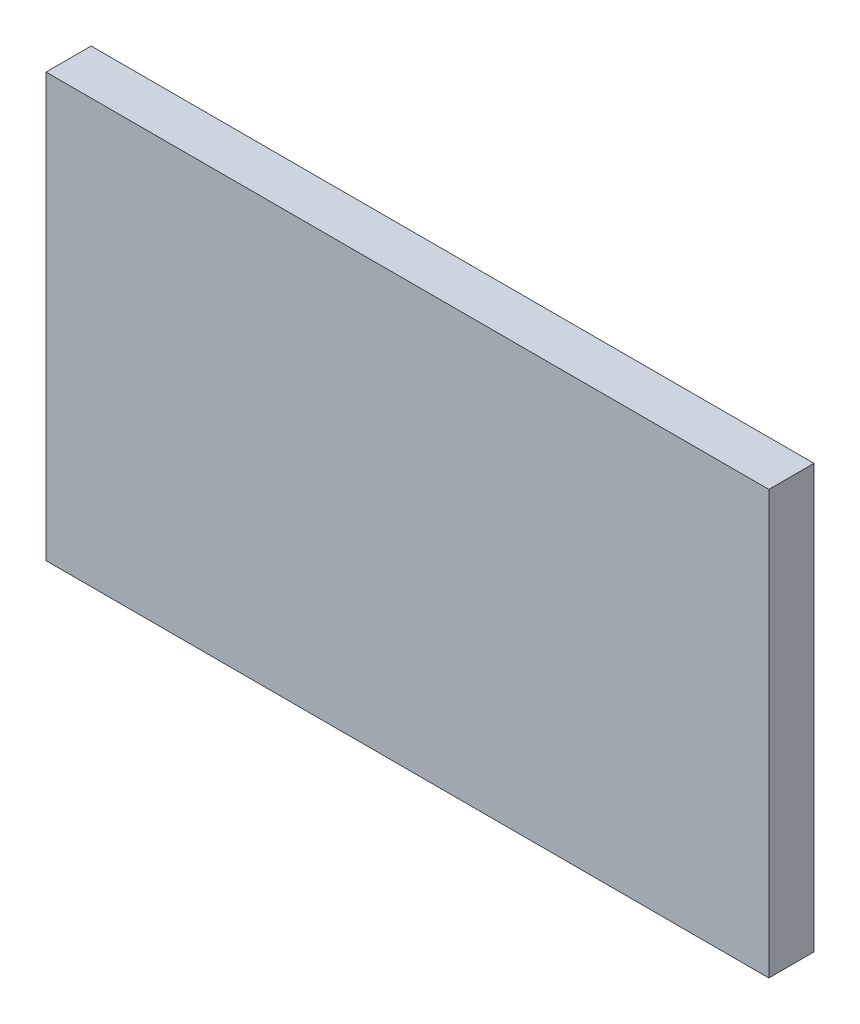
ISO-10303-21;
HEADER;
FILE_DESCRIPTION(('STEP AP214'),'2;1');
FILE_NAME('part.step','',(''),(''),'','','');
FILE_SCHEMA(('AUTOMOTIVE_DESIGN { 1 0 10303 214 1 1 1 1 }'));
ENDSEC;
DATA;
#1=APPLICATION_CONTEXT('core data for automotive mechanical design processes');
#2=APPLICATION_PROTOCOL_DEFINITION('international standard','automotive_design',2000,#1);
#3=PRODUCT_CONTEXT('',#1,'mechanical');
#4=PRODUCT('Part','Part','',(#3));
#5=PRODUCT_RELATED_PRODUCT_CATEGORY('part','',(#4));
#6=PRODUCT_DEFINITION_FORMATION('','',#4);
#7=PRODUCT_DEFINITION_CONTEXT('part definition',#1,'design');
#8=PRODUCT_DEFINITION('design','',#6,#7);
#9=PRODUCT_DEFINITION_SHAPE('','',#8);
#10=(LENGTH_UNIT() NAMED_UNIT(*) SI_UNIT(.MILLI.,.METRE.));
#11=(NAMED_UNIT(*) PLANE_ANGLE_UNIT() SI_UNIT($,.RADIAN.));
#12=(NAMED_UNIT(*) SI_UNIT($,.STERADIAN.) SOLID_ANGLE_UNIT());
#13=UNCERTAINTY_MEASURE_WITH_UNIT(LENGTH_MEASURE(1.E-05),#10,'distance_accuracy_value','');
#14=(GEOMETRIC_REPRESENTATION_CONTEXT(3) GLOBAL_UNCERTAINTY_ASSIGNED_CONTEXT((#13)) GLOBAL_UNIT_ASSIGNED_CONTEXT((#10,
#11,#12)) REPRESENTATION_CONTEXT('',''));
#15=CARTESIAN_POINT('',(0.,0.,0.));
#16=DIRECTION('',(0.,0.,1.));
#17=DIRECTION('',(1.,0.,0.));
#18=AXIS2_PLACEMENT_3D('',#15,#16,#17);
#19=CARTESIAN_POINT('',(0.,0.,19.));
#20=DIRECTION('',(1.,0.,0.));
#21=DIRECTION('',(0.,0.,-1.));
#22=AXIS2_PLACEMENT_3D('',#19,#20,#21);
#23=PLANE('',#22);
#24=DIRECTION('',(0.,-1.,0.));
#25=VECTOR('',#24,1.);
#26=CARTESIAN_POINT('',(0.,0.,0.));
#27=LINE('',#26,#25);
#28=CARTESIAN_POINT('',(0.,178.172572298195,0.));
#29=VERTEX_POINT('',#28);
#30=CARTESIAN_POINT('',(0.,0.,0.));
#31=VERTEX_POINT('',#30);
#32=EDGE_CURVE('E98',#29,#31,#27,.T.);
#33=ORIENTED_EDGE('',*,*,#32,.T.);
#34=DIRECTION('',(0.,0.,-1.));
#35=VECTOR('',#34,1.);
#36=CARTESIAN_POINT('',(0.,0.,19.));
#37=LINE('',#36,#35);
#38=CARTESIAN_POINT('',(0.,0.,19.));
#39=VERTEX_POINT('',#38);
#40=EDGE_CURVE('E11',#39,#31,#37,.T.);
#41=ORIENTED_EDGE('',*,*,#40,.F.);
#42=DIRECTION('',(0.,-1.,0.));
#43=VECTOR('',#42,1.);
#44=CARTESIAN_POINT('',(0.,0.,19.));
#45=LINE('',#44,#43);
#46=CARTESIAN_POINT('',(0.,178.172572298195,19.));
#47=VERTEX_POINT('',#46);
#48=EDGE_CURVE('E86',#47,#39,#45,.T.);
#49=ORIENTED_EDGE('',*,*,#48,.F.);
#50=DIRECTION('',(0.,0.,-1.));
#51=VECTOR('',#50,1.);
#52=CARTESIAN_POINT('',(0.,178.172572298195,19.));
#53=LINE('',#52,#51);
#54=EDGE_CURVE('E94',#47,#29,#53,.T.);
#55=ORIENTED_EDGE('',*,*,#54,.T.);
#56=EDGE_LOOP('',(#33,#41,#49,#55));
#57=FACE_BOUND('',#56,.T.);
#58=ADVANCED_FACE('F35',(#57),#23,.F.);
#59=CARTESIAN_POINT('',(0.,0.,19.));
#60=DIRECTION('',(0.,1.,0.));
#61=DIRECTION('',(0.,0.,1.));
#62=AXIS2_PLACEMENT_3D('',#59,#60,#61);
#63=PLANE('',#62);
#64=DIRECTION('',(1.,0.,0.));
#65=VECTOR('',#64,1.);
#66=CARTESIAN_POINT('',(0.,0.,0.));
#67=LINE('',#66,#65);
#68=CARTESIAN_POINT('',(304.366355201111,0.,0.));
#69=VERTEX_POINT('',#68);
#70=EDGE_CURVE('E90',#31,#69,#67,.T.);
#71=ORIENTED_EDGE('',*,*,#70,.T.);
#72=DIRECTION('',(0.,0.,-1.));
#73=VECTOR('',#72,1.);
#74=CARTESIAN_POINT('',(304.366355201111,0.,19.));
#75=LINE('',#74,#73);
#76=CARTESIAN_POINT('',(304.366355201111,0.,19.));
#77=VERTEX_POINT('',#76);
#78=EDGE_CURVE('E43',#77,#69,#75,.T.);
#79=ORIENTED_EDGE('',*,*,#78,.F.);
#80=DIRECTION('',(1.,0.,0.));
#81=VECTOR('',#80,1.);
#82=CARTESIAN_POINT('',(0.,0.,19.));
#83=LINE('',#82,#81);
#84=EDGE_CURVE('E81',#39,#77,#83,.T.);
#85=ORIENTED_EDGE('',*,*,#84,.F.);
#86=ORIENTED_EDGE('',*,*,#40,.T.);
#87=EDGE_LOOP('',(#71,#79,#85,#86));
#88=FACE_BOUND('',#87,.T.);
#89=ADVANCED_FACE('F89',(#88),#63,.F.);
#90=CARTESIAN_POINT('',(304.366355201111,0.,19.));
#91=DIRECTION('',(-1.,0.,0.));
#92=DIRECTION('',(0.,0.,1.));
#93=AXIS2_PLACEMENT_3D('',#90,#91,#92);
#94=PLANE('',#93);
#95=DIRECTION('',(0.,1.,0.));
#96=VECTOR('',#95,1.);
#97=CARTESIAN_POINT('',(304.366355201111,0.,0.));
#98=LINE('',#97,#96);
#99=CARTESIAN_POINT('',(304.366355201111,178.172572298195,0.));
#100=VERTEX_POINT('',#99);
#101=EDGE_CURVE('E68',#69,#100,#98,.T.);
#102=ORIENTED_EDGE('',*,*,#101,.T.);
#103=DIRECTION('',(0.,0.,-1.));
#104=VECTOR('',#103,1.);
#105=CARTESIAN_POINT('',(304.366355201111,178.172572298195,19.));
#106=LINE('',#105,#104);
#107=CARTESIAN_POINT('',(304.366355201111,178.172572298195,19.));
#108=VERTEX_POINT('',#107);
#109=EDGE_CURVE('E91',#108,#100,#106,.T.);
#110=ORIENTED_EDGE('',*,*,#109,.F.);
#111=DIRECTION('',(0.,1.,0.));
#112=VECTOR('',#111,1.);
#113=CARTESIAN_POINT('',(304.366355201111,0.,19.));
#114=LINE('',#113,#112);
#115=EDGE_CURVE('E84',#77,#108,#114,.T.);
#116=ORIENTED_EDGE('',*,*,#115,.F.);
#117=ORIENTED_EDGE('',*,*,#78,.T.);
#118=EDGE_LOOP('',(#102,#110,#116,#117));
#119=FACE_BOUND('',#118,.T.);
#120=ADVANCED_FACE('F92',(#119),#94,.F.);
#121=CARTESIAN_POINT('',(0.,178.172572298195,19.));
#122=DIRECTION('',(0.,-1.,0.));
#123=DIRECTION('',(0.,0.,-1.));
#124=AXIS2_PLACEMENT_3D('',#121,#122,#123);
#125=PLANE('',#124);
#126=DIRECTION('',(-1.,0.,0.));
#127=VECTOR('',#126,1.);
#128=CARTESIAN_POINT('',(0.,178.172572298195,0.));
#129=LINE('',#128,#127);
#130=EDGE_CURVE('E74',#100,#29,#129,.T.);
#131=ORIENTED_EDGE('',*,*,#130,.T.);
#132=ORIENTED_EDGE('',*,*,#54,.F.);
#133=DIRECTION('',(-1.,0.,0.));
#134=VECTOR('',#133,1.);
#135=CARTESIAN_POINT('',(0.,178.172572298195,19.));
#136=LINE('',#135,#134);
#137=EDGE_CURVE('E51',#108,#47,#136,.T.);
#138=ORIENTED_EDGE('',*,*,#137,.F.);
#139=ORIENTED_EDGE('',*,*,#109,.T.);
#140=EDGE_LOOP('',(#131,#132,#138,#139));
#141=FACE_BOUND('',#140,.T.);
#142=ADVANCED_FACE('F105',(#141),#125,.F.);
#143=CARTESIAN_POINT('',(0.,0.,19.));
#144=DIRECTION('',(0.,0.,-1.));
#145=DIRECTION('',(-1.,0.,0.));
#146=AXIS2_PLACEMENT_3D('',#143,#144,#145);
#147=PLANE('',#146);
#148=ORIENTED_EDGE('',*,*,#48,.T.);
#149=ORIENTED_EDGE('',*,*,#84,.T.);
#150=ORIENTED_EDGE('',*,*,#115,.T.);
#151=ORIENTED_EDGE('',*,*,#137,.T.);
#152=EDGE_LOOP('',(#148,#149,#150,#151));
#153=FACE_BOUND('',#152,.T.);
#154=ADVANCED_FACE('F82',(#153),#147,.F.);
#155=CARTESIAN_POINT('',(0.,0.,0.));
#156=DIRECTION('',(0.,0.,-1.));
#157=DIRECTION('',(-1.,0.,0.));
#158=AXIS2_PLACEMENT_3D('',#155,#156,#157);
#159=PLANE('',#158);
#160=ORIENTED_EDGE('',*,*,#32,.F.);
#161=ORIENTED_EDGE('',*,*,#130,.F.);
#162=ORIENTED_EDGE('',*,*,#101,.F.);
#163=ORIENTED_EDGE('',*,*,#70,.F.);
#164=EDGE_LOOP('',(#160,#161,#162,#163));
#165=FACE_BOUND('',#164,.T.);
#166=ADVANCED_FACE('F108',(#165),#159,.T.);
#167=CLOSED_SHELL('',(#58,#89,#120,#142,#154,#166));
#168=MANIFOLD_SOLID_BREP('B2',#167);
#169=ADVANCED_BREP_SHAPE_REPRESENTATION('',(#18,#168),#14);
#170=SHAPE_DEFINITION_REPRESENTATION(#9,#169);
ENDSEC;
END-ISO-10303-21;
